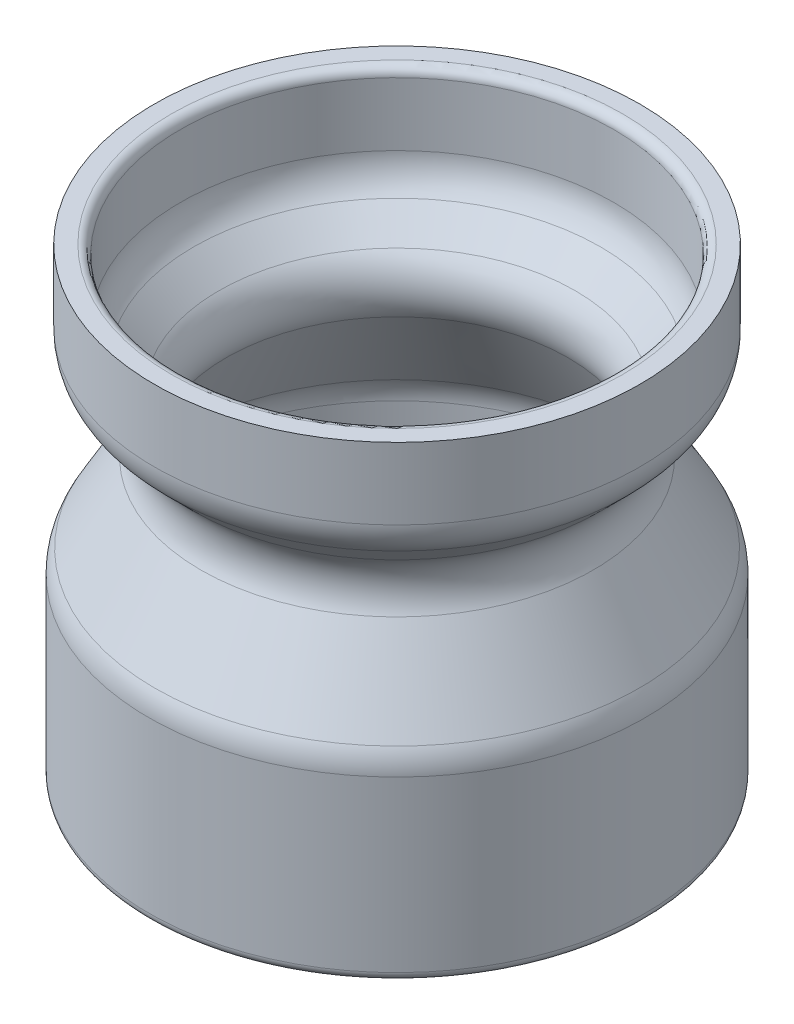
ISO-10303-21;
HEADER;
FILE_DESCRIPTION(('STEP AP214'),'2;1');
FILE_NAME('part.step','',(''),(''),'','','');
FILE_SCHEMA(('AUTOMOTIVE_DESIGN { 1 0 10303 214 1 1 1 1 }'));
ENDSEC;
DATA;
#1=APPLICATION_CONTEXT('core data for automotive mechanical design processes');
#2=APPLICATION_PROTOCOL_DEFINITION('international standard','automotive_design',2000,#1);
#3=PRODUCT_CONTEXT('',#1,'mechanical');
#4=PRODUCT('Part','Part','',(#3));
#5=PRODUCT_RELATED_PRODUCT_CATEGORY('part','',(#4));
#6=PRODUCT_DEFINITION_FORMATION('','',#4);
#7=PRODUCT_DEFINITION_CONTEXT('part definition',#1,'design');
#8=PRODUCT_DEFINITION('design','',#6,#7);
#9=PRODUCT_DEFINITION_SHAPE('','',#8);
#10=(LENGTH_UNIT() NAMED_UNIT(*) SI_UNIT(.MILLI.,.METRE.));
#11=(NAMED_UNIT(*) PLANE_ANGLE_UNIT() SI_UNIT($,.RADIAN.));
#12=(NAMED_UNIT(*) SI_UNIT($,.STERADIAN.) SOLID_ANGLE_UNIT());
#13=UNCERTAINTY_MEASURE_WITH_UNIT(LENGTH_MEASURE(1.E-05),#10,'distance_accuracy_value','');
#14=(GEOMETRIC_REPRESENTATION_CONTEXT(3) GLOBAL_UNCERTAINTY_ASSIGNED_CONTEXT((#13)) GLOBAL_UNIT_ASSIGNED_CONTEXT((#10,
#11,#12)) REPRESENTATION_CONTEXT('',''));
#15=CARTESIAN_POINT('',(0.,0.,0.));
#16=DIRECTION('',(0.,0.,1.));
#17=DIRECTION('',(1.,0.,0.));
#18=AXIS2_PLACEMENT_3D('',#15,#16,#17);
#19=CARTESIAN_POINT('',(-24.,4.,0.));
#20=DIRECTION('',(0.,1.,0.));
#21=DIRECTION('',(0.,0.,1.));
#22=AXIS2_PLACEMENT_3D('',#19,#20,#21);
#23=PLANE('',#22);
#24=DIRECTION('',(0.,0.,-1.));
#25=VECTOR('',#24,1.);
#26=CARTESIAN_POINT('',(13.,4.,3.9));
#27=LINE('',#26,#25);
#28=CARTESIAN_POINT('',(13.,4.,3.9));
#29=VERTEX_POINT('',#28);
#30=CARTESIAN_POINT('',(13.,4.,-4.1));
#31=VERTEX_POINT('',#30);
#32=EDGE_CURVE('E106',#29,#31,#27,.T.);
#33=ORIENTED_EDGE('',*,*,#32,.F.);
#34=CARTESIAN_POINT('',(15.,4.,3.9));
#35=DIRECTION('',(0.,1.,0.));
#36=DIRECTION('',(0.,0.,1.));
#37=AXIS2_PLACEMENT_3D('',#34,#35,#36);
#38=CIRCLE('',#37,2.);
#39=CARTESIAN_POINT('',(17.,4.,3.9));
#40=VERTEX_POINT('',#39);
#41=EDGE_CURVE('E89',#40,#29,#38,.F.);
#42=ORIENTED_EDGE('',*,*,#41,.F.);
#43=DIRECTION('',(0.,0.,1.));
#44=VECTOR('',#43,1.);
#45=CARTESIAN_POINT('',(17.,4.,3.9));
#46=LINE('',#45,#44);
#47=CARTESIAN_POINT('',(17.,4.,-4.1));
#48=VERTEX_POINT('',#47);
#49=EDGE_CURVE('E98',#48,#40,#46,.T.);
#50=ORIENTED_EDGE('',*,*,#49,.F.);
#51=CARTESIAN_POINT('',(15.,4.,-4.1));
#52=DIRECTION('',(0.,1.,0.));
#53=DIRECTION('',(0.,0.,1.));
#54=AXIS2_PLACEMENT_3D('',#51,#52,#53);
#55=CIRCLE('',#54,2.);
#56=EDGE_CURVE('E61',#31,#48,#55,.F.);
#57=ORIENTED_EDGE('',*,*,#56,.F.);
#58=EDGE_LOOP('',(#33,#42,#50,#57));
#59=FACE_BOUND('',#58,.T.);
#60=CARTESIAN_POINT('',(0.,4.,0.));
#61=DIRECTION('',(0.,-1.,0.));
#62=DIRECTION('',(0.,0.,-1.));
#63=AXIS2_PLACEMENT_3D('',#60,#61,#62);
#64=CIRCLE('',#63,2.5);
#65=CARTESIAN_POINT('',(0.,4.,-2.5));
#66=VERTEX_POINT('',#65);
#67=EDGE_CURVE('E12',#66,#66,#64,.T.);
#68=ORIENTED_EDGE('',*,*,#67,.F.);
#69=EDGE_LOOP('',(#68));
#70=FACE_BOUND('',#69,.T.);
#71=CARTESIAN_POINT('',(0.,4.,0.));
#72=DIRECTION('',(0.,-1.,0.));
#73=DIRECTION('',(0.,0.,-1.));
#74=AXIS2_PLACEMENT_3D('',#71,#72,#73);
#75=CIRCLE('',#74,24.);
#76=CARTESIAN_POINT('',(0.,4.,-24.));
#77=VERTEX_POINT('',#76);
#78=EDGE_CURVE('E101',#77,#77,#75,.T.);
#79=ORIENTED_EDGE('',*,*,#78,.T.);
#80=EDGE_LOOP('',(#79));
#81=FACE_BOUND('',#80,.T.);
#82=ADVANCED_FACE('F47',(#59,#70,#81),#23,.F.);
#83=CARTESIAN_POINT('',(0.,0.,0.));
#84=DIRECTION('',(0.,-1.,0.));
#85=DIRECTION('',(0.,0.,-1.));
#86=AXIS2_PLACEMENT_3D('',#83,#84,#85);
#87=CYLINDRICAL_SURFACE('',#86,2.5);
#88=CARTESIAN_POINT('',(0.,6.,0.));
#89=DIRECTION('',(0.,-1.,0.));
#90=DIRECTION('',(0.,0.,-1.));
#91=AXIS2_PLACEMENT_3D('',#88,#89,#90);
#92=CIRCLE('',#91,2.5);
#93=CARTESIAN_POINT('',(0.,6.,-2.5));
#94=VERTEX_POINT('',#93);
#95=EDGE_CURVE('E54',#94,#94,#92,.T.);
#96=ORIENTED_EDGE('',*,*,#95,.F.);
#97=EDGE_LOOP('',(#96));
#98=FACE_BOUND('',#97,.T.);
#99=ORIENTED_EDGE('',*,*,#67,.T.);
#100=EDGE_LOOP('',(#99));
#101=FACE_BOUND('',#100,.T.);
#102=ADVANCED_FACE('F138',(#98,#101),#87,.F.);
#103=CARTESIAN_POINT('',(-2.5,6.,0.));
#104=DIRECTION('',(0.,-1.,0.));
#105=DIRECTION('',(0.,0.,-1.));
#106=AXIS2_PLACEMENT_3D('',#103,#104,#105);
#107=PLANE('',#106);
#108=DIRECTION('',(0.,0.,-1.));
#109=VECTOR('',#108,1.);
#110=CARTESIAN_POINT('',(17.,6.,3.9));
#111=LINE('',#110,#109);
#112=CARTESIAN_POINT('',(17.,6.,3.9));
#113=VERTEX_POINT('',#112);
#114=CARTESIAN_POINT('',(17.,6.,-4.1));
#115=VERTEX_POINT('',#114);
#116=EDGE_CURVE('E108',#113,#115,#111,.T.);
#117=ORIENTED_EDGE('',*,*,#116,.F.);
#118=CARTESIAN_POINT('',(15.,6.,3.9));
#119=DIRECTION('',(0.,1.,0.));
#120=DIRECTION('',(0.,0.,1.));
#121=AXIS2_PLACEMENT_3D('',#118,#119,#120);
#122=CIRCLE('',#121,2.);
#123=CARTESIAN_POINT('',(13.,6.,3.9));
#124=VERTEX_POINT('',#123);
#125=EDGE_CURVE('E69',#124,#113,#122,.T.);
#126=ORIENTED_EDGE('',*,*,#125,.F.);
#127=DIRECTION('',(0.,0.,1.));
#128=VECTOR('',#127,1.);
#129=CARTESIAN_POINT('',(13.,6.,3.9));
#130=LINE('',#129,#128);
#131=CARTESIAN_POINT('',(13.,6.,-4.1));
#132=VERTEX_POINT('',#131);
#133=EDGE_CURVE('E95',#132,#124,#130,.T.);
#134=ORIENTED_EDGE('',*,*,#133,.F.);
#135=CARTESIAN_POINT('',(15.,6.,-4.1));
#136=DIRECTION('',(0.,1.,0.));
#137=DIRECTION('',(0.,0.,1.));
#138=AXIS2_PLACEMENT_3D('',#135,#136,#137);
#139=CIRCLE('',#138,2.);
#140=EDGE_CURVE('E114',#115,#132,#139,.T.);
#141=ORIENTED_EDGE('',*,*,#140,.F.);
#142=EDGE_LOOP('',(#117,#126,#134,#141));
#143=FACE_BOUND('',#142,.T.);
#144=CARTESIAN_POINT('',(0.,6.,0.));
#145=DIRECTION('',(0.,-1.,0.));
#146=DIRECTION('',(0.,0.,-1.));
#147=AXIS2_PLACEMENT_3D('',#144,#145,#146);
#148=CIRCLE('',#147,24.);
#149=CARTESIAN_POINT('',(0.,6.,-24.));
#150=VERTEX_POINT('',#149);
#151=EDGE_CURVE('E131',#150,#150,#148,.T.);
#152=ORIENTED_EDGE('',*,*,#151,.F.);
#153=EDGE_LOOP('',(#152));
#154=FACE_BOUND('',#153,.T.);
#155=ORIENTED_EDGE('',*,*,#95,.T.);
#156=EDGE_LOOP('',(#155));
#157=FACE_BOUND('',#156,.T.);
#158=ADVANCED_FACE('F136',(#143,#154,#157),#107,.F.);
#159=CARTESIAN_POINT('',(0.,5.5,0.));
#160=DIRECTION('',(0.,-1.,0.));
#161=DIRECTION('',(0.,0.,-1.));
#162=AXIS2_PLACEMENT_3D('',#159,#160,#161);
#163=TOROIDAL_SURFACE('',#162,24.,0.5);
#164=CARTESIAN_POINT('',(0.,5.49999999999999,0.));
#165=DIRECTION('',(0.,-1.,0.));
#166=DIRECTION('',(0.,0.,-1.));
#167=AXIS2_PLACEMENT_3D('',#164,#165,#166);
#168=CIRCLE('',#167,24.5);
#169=CARTESIAN_POINT('',(0.,5.49999999999999,-24.5));
#170=VERTEX_POINT('',#169);
#171=EDGE_CURVE('E128',#170,#170,#168,.T.);
#172=ORIENTED_EDGE('',*,*,#171,.F.);
#173=EDGE_LOOP('',(#172));
#174=FACE_BOUND('',#173,.T.);
#175=ORIENTED_EDGE('',*,*,#151,.T.);
#176=EDGE_LOOP('',(#175));
#177=FACE_BOUND('',#176,.T.);
#178=ADVANCED_FACE('F155',(#174,#177),#163,.T.);
#179=CARTESIAN_POINT('',(0.,0.,0.));
#180=DIRECTION('',(0.,-1.,0.));
#181=DIRECTION('',(0.,0.,-1.));
#182=AXIS2_PLACEMENT_3D('',#179,#180,#181);
#183=CYLINDRICAL_SURFACE('',#182,24.5);
#184=CARTESIAN_POINT('',(0.,4.5,0.));
#185=DIRECTION('',(0.,-1.,0.));
#186=DIRECTION('',(0.,0.,-1.));
#187=AXIS2_PLACEMENT_3D('',#184,#185,#186);
#188=CIRCLE('',#187,24.5);
#189=CARTESIAN_POINT('',(0.,4.5,-24.5));
#190=VERTEX_POINT('',#189);
#191=EDGE_CURVE('E125',#190,#190,#188,.T.);
#192=ORIENTED_EDGE('',*,*,#191,.F.);
#193=EDGE_LOOP('',(#192));
#194=FACE_BOUND('',#193,.T.);
#195=ORIENTED_EDGE('',*,*,#171,.T.);
#196=EDGE_LOOP('',(#195));
#197=FACE_BOUND('',#196,.T.);
#198=ADVANCED_FACE('F149',(#194,#197),#183,.T.);
#199=CARTESIAN_POINT('',(0.,4.5,0.));
#200=DIRECTION('',(0.,-1.,0.));
#201=DIRECTION('',(0.,0.,-1.));
#202=AXIS2_PLACEMENT_3D('',#199,#200,#201);
#203=TOROIDAL_SURFACE('',#202,24.,0.5);
#204=ORIENTED_EDGE('',*,*,#78,.F.);
#205=EDGE_LOOP('',(#204));
#206=FACE_BOUND('',#205,.T.);
#207=ORIENTED_EDGE('',*,*,#191,.T.);
#208=EDGE_LOOP('',(#207));
#209=FACE_BOUND('',#208,.T.);
#210=ADVANCED_FACE('F146',(#206,#209),#203,.T.);
#211=CARTESIAN_POINT('',(15.,-0.00100000000000273,3.9));
#212=DIRECTION('',(0.,1.,0.));
#213=DIRECTION('',(0.,0.,1.));
#214=AXIS2_PLACEMENT_3D('',#211,#212,#213);
#215=CYLINDRICAL_SURFACE('',#214,2.);
#216=ORIENTED_EDGE('',*,*,#41,.T.);
#217=DIRECTION('',(0.,1.,0.));
#218=VECTOR('',#217,1.);
#219=CARTESIAN_POINT('',(13.,-0.00100000000000273,3.9));
#220=LINE('',#219,#218);
#221=EDGE_CURVE('E102',#29,#124,#220,.T.);
#222=ORIENTED_EDGE('',*,*,#221,.T.);
#223=ORIENTED_EDGE('',*,*,#125,.T.);
#224=DIRECTION('',(0.,1.,0.));
#225=VECTOR('',#224,1.);
#226=CARTESIAN_POINT('',(17.,-0.00100000000000273,3.9));
#227=LINE('',#226,#225);
#228=EDGE_CURVE('E85',#40,#113,#227,.T.);
#229=ORIENTED_EDGE('',*,*,#228,.F.);
#230=EDGE_LOOP('',(#216,#222,#223,#229));
#231=FACE_BOUND('',#230,.T.);
#232=ADVANCED_FACE('F87',(#231),#215,.F.);
#233=CARTESIAN_POINT('',(13.,-0.00100000000000273,3.9));
#234=DIRECTION('',(-1.,0.,0.));
#235=DIRECTION('',(0.,0.,1.));
#236=AXIS2_PLACEMENT_3D('',#233,#234,#235);
#237=PLANE('',#236);
#238=ORIENTED_EDGE('',*,*,#32,.T.);
#239=DIRECTION('',(0.,1.,0.));
#240=VECTOR('',#239,1.);
#241=CARTESIAN_POINT('',(13.,-0.00100000000000273,-4.1));
#242=LINE('',#241,#240);
#243=EDGE_CURVE('E120',#31,#132,#242,.T.);
#244=ORIENTED_EDGE('',*,*,#243,.T.);
#245=ORIENTED_EDGE('',*,*,#133,.T.);
#246=ORIENTED_EDGE('',*,*,#221,.F.);
#247=EDGE_LOOP('',(#238,#244,#245,#246));
#248=FACE_BOUND('',#247,.T.);
#249=ADVANCED_FACE('F172',(#248),#237,.F.);
#250=CARTESIAN_POINT('',(15.,-0.00100000000000273,-4.1));
#251=DIRECTION('',(0.,1.,0.));
#252=DIRECTION('',(0.,0.,1.));
#253=AXIS2_PLACEMENT_3D('',#250,#251,#252);
#254=CYLINDRICAL_SURFACE('',#253,2.);
#255=ORIENTED_EDGE('',*,*,#56,.T.);
#256=DIRECTION('',(0.,1.,0.));
#257=VECTOR('',#256,1.);
#258=CARTESIAN_POINT('',(17.,-0.00100000000000273,-4.1));
#259=LINE('',#258,#257);
#260=EDGE_CURVE('E94',#48,#115,#259,.T.);
#261=ORIENTED_EDGE('',*,*,#260,.T.);
#262=ORIENTED_EDGE('',*,*,#140,.T.);
#263=ORIENTED_EDGE('',*,*,#243,.F.);
#264=EDGE_LOOP('',(#255,#261,#262,#263));
#265=FACE_BOUND('',#264,.T.);
#266=ADVANCED_FACE('F175',(#265),#254,.F.);
#267=CARTESIAN_POINT('',(17.,-0.00100000000000273,3.9));
#268=DIRECTION('',(1.,0.,0.));
#269=DIRECTION('',(0.,0.,-1.));
#270=AXIS2_PLACEMENT_3D('',#267,#268,#269);
#271=PLANE('',#270);
#272=ORIENTED_EDGE('',*,*,#49,.T.);
#273=ORIENTED_EDGE('',*,*,#228,.T.);
#274=ORIENTED_EDGE('',*,*,#116,.T.);
#275=ORIENTED_EDGE('',*,*,#260,.F.);
#276=EDGE_LOOP('',(#272,#273,#274,#275));
#277=FACE_BOUND('',#276,.T.);
#278=ADVANCED_FACE('F99',(#277),#271,.F.);
#279=CLOSED_SHELL('',(#82,#102,#158,#178,#198,#210,#232,#249,#266,#278));
#280=MANIFOLD_SOLID_BREP('B2',#279);
#281=CARTESIAN_POINT('',(0.,0.,0.));
#282=DIRECTION('',(0.,-1.,0.));
#283=DIRECTION('',(0.,0.,-1.));
#284=AXIS2_PLACEMENT_3D('',#281,#282,#283);
#285=CYLINDRICAL_SURFACE('',#284,2.5);
#286=CARTESIAN_POINT('',(0.,2.,0.));
#287=DIRECTION('',(0.,-1.,0.));
#288=DIRECTION('',(0.,0.,-1.));
#289=AXIS2_PLACEMENT_3D('',#286,#287,#288);
#290=CIRCLE('',#289,2.5);
#291=CARTESIAN_POINT('',(0.,2.,-2.5));
#292=VERTEX_POINT('',#291);
#293=EDGE_CURVE('E297',#292,#292,#290,.T.);
#294=ORIENTED_EDGE('',*,*,#293,.F.);
#295=EDGE_LOOP('',(#294));
#296=FACE_BOUND('',#295,.T.);
#297=CARTESIAN_POINT('',(0.,0.,0.));
#298=DIRECTION('',(0.,-1.,0.));
#299=DIRECTION('',(0.,0.,-1.));
#300=AXIS2_PLACEMENT_3D('',#297,#298,#299);
#301=CIRCLE('',#300,2.5);
#302=CARTESIAN_POINT('',(0.,0.,-2.5));
#303=VERTEX_POINT('',#302);
#304=EDGE_CURVE('E45',#303,#303,#301,.T.);
#305=ORIENTED_EDGE('',*,*,#304,.T.);
#306=EDGE_LOOP('',(#305));
#307=FACE_BOUND('',#306,.T.);
#308=ADVANCED_FACE('F243',(#296,#307),#285,.F.);
#309=CARTESIAN_POINT('',(-2.5,0.,0.));
#310=DIRECTION('',(0.,1.,0.));
#311=DIRECTION('',(0.,0.,1.));
#312=AXIS2_PLACEMENT_3D('',#309,#310,#311);
#313=PLANE('',#312);
#314=DIRECTION('',(0.,0.,1.));
#315=VECTOR('',#314,1.);
#316=CARTESIAN_POINT('',(-13.,0.,-3.9));
#317=LINE('',#316,#315);
#318=CARTESIAN_POINT('',(-13.,0.,-3.9));
#319=VERTEX_POINT('',#318);
#320=CARTESIAN_POINT('',(-13.,0.,4.1));
#321=VERTEX_POINT('',#320);
#322=EDGE_CURVE('E305',#319,#321,#317,.T.);
#323=ORIENTED_EDGE('',*,*,#322,.F.);
#324=CARTESIAN_POINT('',(-15.,0.,-3.9));
#325=DIRECTION('',(0.,-1.,0.));
#326=DIRECTION('',(0.,0.,-1.));
#327=AXIS2_PLACEMENT_3D('',#324,#325,#326);
#328=CIRCLE('',#327,2.);
#329=CARTESIAN_POINT('',(-17.,0.,-3.9));
#330=VERTEX_POINT('',#329);
#331=EDGE_CURVE('E257',#330,#319,#328,.T.);
#332=ORIENTED_EDGE('',*,*,#331,.F.);
#333=DIRECTION('',(0.,0.,-1.));
#334=VECTOR('',#333,1.);
#335=CARTESIAN_POINT('',(-17.,0.,-3.9));
#336=LINE('',#335,#334);
#337=CARTESIAN_POINT('',(-17.,0.,4.1));
#338=VERTEX_POINT('',#337);
#339=EDGE_CURVE('E291',#338,#330,#336,.T.);
#340=ORIENTED_EDGE('',*,*,#339,.F.);
#341=CARTESIAN_POINT('',(-15.,0.,4.1));
#342=DIRECTION('',(0.,-1.,0.));
#343=DIRECTION('',(0.,0.,-1.));
#344=AXIS2_PLACEMENT_3D('',#341,#342,#343);
#345=CIRCLE('',#344,2.);
#346=EDGE_CURVE('E311',#321,#338,#345,.T.);
#347=ORIENTED_EDGE('',*,*,#346,.F.);
#348=EDGE_LOOP('',(#323,#332,#340,#347));
#349=FACE_BOUND('',#348,.T.);
#350=ORIENTED_EDGE('',*,*,#304,.F.);
#351=EDGE_LOOP('',(#350));
#352=FACE_BOUND('',#351,.T.);
#353=CARTESIAN_POINT('',(0.,0.,0.));
#354=DIRECTION('',(0.,-1.,0.));
#355=DIRECTION('',(0.,0.,-1.));
#356=AXIS2_PLACEMENT_3D('',#353,#354,#355);
#357=CIRCLE('',#356,26.5);
#358=CARTESIAN_POINT('',(0.,0.,-26.5));
#359=VERTEX_POINT('',#358);
#360=EDGE_CURVE('E250',#359,#359,#357,.T.);
#361=ORIENTED_EDGE('',*,*,#360,.T.);
#362=EDGE_LOOP('',(#361));
#363=FACE_BOUND('',#362,.T.);
#364=ADVANCED_FACE('F378',(#349,#352,#363),#313,.F.);
#365=CARTESIAN_POINT('',(0.,0.999999999999997,0.));
#366=DIRECTION('',(0.,-1.,0.));
#367=DIRECTION('',(0.,0.,-1.));
#368=AXIS2_PLACEMENT_3D('',#365,#366,#367);
#369=TOROIDAL_SURFACE('',#368,26.5,1.);
#370=ORIENTED_EDGE('',*,*,#360,.F.);
#371=EDGE_LOOP('',(#370));
#372=FACE_BOUND('',#371,.T.);
#373=CARTESIAN_POINT('',(0.,0.999999999999997,0.));
#374=DIRECTION('',(0.,-1.,0.));
#375=DIRECTION('',(0.,0.,-1.));
#376=AXIS2_PLACEMENT_3D('',#373,#374,#375);
#377=CIRCLE('',#376,27.5);
#378=CARTESIAN_POINT('',(0.,0.999999999999997,-27.5));
#379=VERTEX_POINT('',#378);
#380=EDGE_CURVE('E373',#379,#379,#377,.T.);
#381=ORIENTED_EDGE('',*,*,#380,.T.);
#382=EDGE_LOOP('',(#381));
#383=FACE_BOUND('',#382,.T.);
#384=ADVANCED_FACE('F380',(#372,#383),#369,.T.);
#385=CARTESIAN_POINT('',(0.,0.,0.));
#386=DIRECTION('',(0.,-1.,0.));
#387=DIRECTION('',(0.,0.,-1.));
#388=AXIS2_PLACEMENT_3D('',#385,#386,#387);
#389=CYLINDRICAL_SURFACE('',#388,27.5);
#390=ORIENTED_EDGE('',*,*,#380,.F.);
#391=EDGE_LOOP('',(#390));
#392=FACE_BOUND('',#391,.T.);
#393=CARTESIAN_POINT('',(0.,19.7594108681067,0.));
#394=DIRECTION('',(0.,-1.,0.));
#395=DIRECTION('',(0.,0.,-1.));
#396=AXIS2_PLACEMENT_3D('',#393,#394,#395);
#397=CIRCLE('',#396,27.5);
#398=CARTESIAN_POINT('',(0.,19.7594108681067,-27.5));
#399=VERTEX_POINT('',#398);
#400=EDGE_CURVE('E370',#399,#399,#397,.T.);
#401=ORIENTED_EDGE('',*,*,#400,.T.);
#402=EDGE_LOOP('',(#401));
#403=FACE_BOUND('',#402,.T.);
#404=ADVANCED_FACE('F383',(#392,#403),#389,.T.);
#405=CARTESIAN_POINT('',(0.,19.7594108681067,0.));
#406=DIRECTION('',(0.,-1.,0.));
#407=DIRECTION('',(0.,0.,-1.));
#408=AXIS2_PLACEMENT_3D('',#405,#406,#407);
#409=TOROIDAL_SURFACE('',#408,22.5,5.);
#410=ORIENTED_EDGE('',*,*,#400,.F.);
#411=EDGE_LOOP('',(#410));
#412=FACE_BOUND('',#411,.T.);
#413=CARTESIAN_POINT('',(0.,22.2594108681067,0.));
#414=DIRECTION('',(0.,-1.,0.));
#415=DIRECTION('',(0.,0.,-1.));
#416=AXIS2_PLACEMENT_3D('',#413,#414,#415);
#417=CIRCLE('',#416,26.8301270189222);
#418=CARTESIAN_POINT('',(0.,22.2594108681067,-26.8301270189222));
#419=VERTEX_POINT('',#418);
#420=EDGE_CURVE('E367',#419,#419,#417,.T.);
#421=ORIENTED_EDGE('',*,*,#420,.T.);
#422=EDGE_LOOP('',(#421));
#423=FACE_BOUND('',#422,.T.);
#424=ADVANCED_FACE('F389',(#412,#423),#409,.T.);
#425=CARTESIAN_POINT('',(0.,31.0600265176964,0.));
#426=DIRECTION('',(0.,-1.,0.));
#427=DIRECTION('',(0.,0.,-1.));
#428=AXIS2_PLACEMENT_3D('',#425,#426,#427);
#429=CONICAL_SURFACE('',#428,21.7490892045971,0.5235987755983);
#430=ORIENTED_EDGE('',*,*,#420,.F.);
#431=EDGE_LOOP('',(#430));
#432=FACE_BOUND('',#431,.T.);
#433=CARTESIAN_POINT('',(0.,31.0600265176964,0.));
#434=DIRECTION('',(0.,-1.,0.));
#435=DIRECTION('',(0.,0.,-1.));
#436=AXIS2_PLACEMENT_3D('',#433,#434,#435);
#437=CIRCLE('',#436,21.7490892045971);
#438=CARTESIAN_POINT('',(0.,31.0600265176964,-21.7490892045971));
#439=VERTEX_POINT('',#438);
#440=EDGE_CURVE('E364',#439,#439,#437,.T.);
#441=ORIENTED_EDGE('',*,*,#440,.T.);
#442=EDGE_LOOP('',(#441));
#443=FACE_BOUND('',#442,.T.);
#444=ADVANCED_FACE('F395',(#432,#443),#429,.T.);
#445=CARTESIAN_POINT('',(0.,33.5600265176964,0.));
#446=DIRECTION('',(0.,-1.,0.));
#447=DIRECTION('',(0.,0.,-1.));
#448=AXIS2_PLACEMENT_3D('',#445,#446,#447);
#449=TOROIDAL_SURFACE('',#448,26.0792162235193,5.);
#450=ORIENTED_EDGE('',*,*,#440,.F.);
#451=EDGE_LOOP('',(#450));
#452=FACE_BOUND('',#451,.T.);
#453=CARTESIAN_POINT('',(0.,37.0955604236291,0.));
#454=DIRECTION('',(0.,-1.,0.));
#455=DIRECTION('',(0.,0.,-1.));
#456=AXIS2_PLACEMENT_3D('',#453,#454,#455);
#457=CIRCLE('',#456,22.5436823175865);
#458=CARTESIAN_POINT('',(0.,37.0955604236291,-22.5436823175865));
#459=VERTEX_POINT('',#458);
#460=EDGE_CURVE('E361',#459,#459,#457,.T.);
#461=ORIENTED_EDGE('',*,*,#460,.T.);
#462=EDGE_LOOP('',(#461));
#463=FACE_BOUND('',#462,.T.);
#464=ADVANCED_FACE('F401',(#452,#463),#449,.F.);
#465=CARTESIAN_POINT('',(0.,39.9892515584906,0.));
#466=DIRECTION('',(0.,1.,0.));
#467=DIRECTION('',(0.,0.,1.));
#468=AXIS2_PLACEMENT_3D('',#465,#466,#467);
#469=CONICAL_SURFACE('',#468,25.4373734524479,0.785398163397429);
#470=ORIENTED_EDGE('',*,*,#460,.F.);
#471=EDGE_LOOP('',(#470));
#472=FACE_BOUND('',#471,.T.);
#473=CARTESIAN_POINT('',(0.,39.9892515584906,0.));
#474=DIRECTION('',(0.,-1.,0.));
#475=DIRECTION('',(0.,0.,-1.));
#476=AXIS2_PLACEMENT_3D('',#473,#474,#475);
#477=CIRCLE('',#476,25.4373734524479);
#478=CARTESIAN_POINT('',(0.,39.9892515584906,-25.4373734524479));
#479=VERTEX_POINT('',#478);
#480=EDGE_CURVE('E358',#479,#479,#477,.T.);
#481=ORIENTED_EDGE('',*,*,#480,.T.);
#482=EDGE_LOOP('',(#481));
#483=FACE_BOUND('',#482,.T.);
#484=ADVANCED_FACE('F407',(#472,#483),#469,.T.);
#485=CARTESIAN_POINT('',(0.,43.5247854644232,0.));
#486=DIRECTION('',(0.,-1.,0.));
#487=DIRECTION('',(0.,0.,-1.));
#488=AXIS2_PLACEMENT_3D('',#485,#486,#487);
#489=TOROIDAL_SURFACE('',#488,21.9018395465151,5.);
#490=ORIENTED_EDGE('',*,*,#480,.F.);
#491=EDGE_LOOP('',(#490));
#492=FACE_BOUND('',#491,.T.);
#493=CARTESIAN_POINT('',(0.,43.5247854644232,0.));
#494=DIRECTION('',(0.,-1.,0.));
#495=DIRECTION('',(0.,0.,-1.));
#496=AXIS2_PLACEMENT_3D('',#493,#494,#495);
#497=CIRCLE('',#496,26.9018395465151);
#498=CARTESIAN_POINT('',(0.,43.5247854644232,-26.9018395465151));
#499=VERTEX_POINT('',#498);
#500=EDGE_CURVE('E355',#499,#499,#497,.T.);
#501=ORIENTED_EDGE('',*,*,#500,.T.);
#502=EDGE_LOOP('',(#501));
#503=FACE_BOUND('',#502,.T.);
#504=ADVANCED_FACE('F413',(#492,#503),#489,.T.);
#505=CARTESIAN_POINT('',(0.,0.,0.));
#506=DIRECTION('',(0.,-1.,0.));
#507=DIRECTION('',(0.,0.,-1.));
#508=AXIS2_PLACEMENT_3D('',#505,#506,#507);
#509=CYLINDRICAL_SURFACE('',#508,26.9018395465151);
#510=ORIENTED_EDGE('',*,*,#500,.F.);
#511=EDGE_LOOP('',(#510));
#512=FACE_BOUND('',#511,.T.);
#513=CARTESIAN_POINT('',(0.,51.4537176525578,0.));
#514=DIRECTION('',(0.,-1.,0.));
#515=DIRECTION('',(0.,0.,-1.));
#516=AXIS2_PLACEMENT_3D('',#513,#514,#515);
#517=CIRCLE('',#516,26.9018395465151);
#518=CARTESIAN_POINT('',(0.,51.4537176525578,-26.9018395465151));
#519=VERTEX_POINT('',#518);
#520=EDGE_CURVE('E352',#519,#519,#517,.T.);
#521=ORIENTED_EDGE('',*,*,#520,.T.);
#522=EDGE_LOOP('',(#521));
#523=FACE_BOUND('',#522,.T.);
#524=ADVANCED_FACE('F419',(#512,#523),#509,.T.);
#525=CARTESIAN_POINT('',(-25.0087993028391,51.4537176525578,0.));
#526=DIRECTION('',(0.,-1.,0.));
#527=DIRECTION('',(0.,0.,-1.));
#528=AXIS2_PLACEMENT_3D('',#525,#526,#527);
#529=PLANE('',#528);
#530=ORIENTED_EDGE('',*,*,#520,.F.);
#531=EDGE_LOOP('',(#530));
#532=FACE_BOUND('',#531,.T.);
#533=CARTESIAN_POINT('',(0.,51.4537176525578,0.));
#534=DIRECTION('',(0.,-1.,0.));
#535=DIRECTION('',(0.,0.,-1.));
#536=AXIS2_PLACEMENT_3D('',#533,#534,#535);
#537=CIRCLE('',#536,25.0087993028391);
#538=CARTESIAN_POINT('',(0.,51.4537176525578,-25.0087993028391));
#539=VERTEX_POINT('',#538);
#540=EDGE_CURVE('E349',#539,#539,#537,.T.);
#541=ORIENTED_EDGE('',*,*,#540,.T.);
#542=EDGE_LOOP('',(#541));
#543=FACE_BOUND('',#542,.T.);
#544=ADVANCED_FACE('F425',(#532,#543),#529,.F.);
#545=CARTESIAN_POINT('',(0.,50.4537176525578,0.));
#546=DIRECTION('',(0.,-1.,0.));
#547=DIRECTION('',(0.,0.,-1.));
#548=AXIS2_PLACEMENT_3D('',#545,#546,#547);
#549=TOROIDAL_SURFACE('',#548,25.0087993028392,0.999999999999997);
#550=ORIENTED_EDGE('',*,*,#540,.F.);
#551=EDGE_LOOP('',(#550));
#552=FACE_BOUND('',#551,.T.);
#553=CARTESIAN_POINT('',(0.,50.4537176525578,0.));
#554=DIRECTION('',(0.,-1.,0.));
#555=DIRECTION('',(0.,0.,-1.));
#556=AXIS2_PLACEMENT_3D('',#553,#554,#555);
#557=CIRCLE('',#556,24.0087993028392);
#558=CARTESIAN_POINT('',(0.,50.4537176525578,-24.0087993028392));
#559=VERTEX_POINT('',#558);
#560=EDGE_CURVE('E346',#559,#559,#557,.T.);
#561=ORIENTED_EDGE('',*,*,#560,.T.);
#562=EDGE_LOOP('',(#561));
#563=FACE_BOUND('',#562,.T.);
#564=ADVANCED_FACE('F431',(#552,#563),#549,.T.);
#565=CARTESIAN_POINT('',(0.,0.,0.));
#566=DIRECTION('',(0.,-1.,0.));
#567=DIRECTION('',(0.,0.,-1.));
#568=AXIS2_PLACEMENT_3D('',#565,#566,#567);
#569=CYLINDRICAL_SURFACE('',#568,24.0087993028392);
#570=ORIENTED_EDGE('',*,*,#560,.F.);
#571=EDGE_LOOP('',(#570));
#572=FACE_BOUND('',#571,.T.);
#573=CARTESIAN_POINT('',(0.,43.4601723454934,0.));
#574=DIRECTION('',(0.,-1.,0.));
#575=DIRECTION('',(0.,0.,-1.));
#576=AXIS2_PLACEMENT_3D('',#573,#574,#575);
#577=CIRCLE('',#576,24.0087993028392);
#578=CARTESIAN_POINT('',(0.,43.4601723454934,-24.0087993028392));
#579=VERTEX_POINT('',#578);
#580=EDGE_CURVE('E343',#579,#579,#577,.T.);
#581=ORIENTED_EDGE('',*,*,#580,.T.);
#582=EDGE_LOOP('',(#581));
#583=FACE_BOUND('',#582,.T.);
#584=ADVANCED_FACE('F437',(#572,#583),#569,.F.);
#585=CARTESIAN_POINT('',(0.,43.4601723454934,0.));
#586=DIRECTION('',(0.,-1.,0.));
#587=DIRECTION('',(0.,0.,-1.));
#588=AXIS2_PLACEMENT_3D('',#585,#586,#587);
#589=TOROIDAL_SURFACE('',#588,19.0087993028392,5.);
#590=ORIENTED_EDGE('',*,*,#580,.F.);
#591=EDGE_LOOP('',(#590));
#592=FACE_BOUND('',#591,.T.);
#593=CARTESIAN_POINT('',(0.,39.9246384395608,0.));
#594=DIRECTION('',(0.,-1.,0.));
#595=DIRECTION('',(0.,0.,-1.));
#596=AXIS2_PLACEMENT_3D('',#593,#594,#595);
#597=CIRCLE('',#596,22.544333208772);
#598=CARTESIAN_POINT('',(0.,39.9246384395608,-22.544333208772));
#599=VERTEX_POINT('',#598);
#600=EDGE_CURVE('E340',#599,#599,#597,.T.);
#601=ORIENTED_EDGE('',*,*,#600,.T.);
#602=EDGE_LOOP('',(#601));
#603=FACE_BOUND('',#602,.T.);
#604=ADVANCED_FACE('F443',(#592,#603),#589,.F.);
#605=CARTESIAN_POINT('',(0.,37.122047683819,0.));
#606=DIRECTION('',(0.,1.,0.));
#607=DIRECTION('',(0.,0.,1.));
#608=AXIS2_PLACEMENT_3D('',#605,#606,#607);
#609=CONICAL_SURFACE('',#608,19.7417424530304,0.785398163397427);
#610=ORIENTED_EDGE('',*,*,#600,.F.);
#611=EDGE_LOOP('',(#610));
#612=FACE_BOUND('',#611,.T.);
#613=CARTESIAN_POINT('',(0.,37.122047683819,0.));
#614=DIRECTION('',(0.,-1.,0.));
#615=DIRECTION('',(0.,0.,-1.));
#616=AXIS2_PLACEMENT_3D('',#613,#614,#615);
#617=CIRCLE('',#616,19.7417424530304);
#618=CARTESIAN_POINT('',(0.,37.122047683819,-19.7417424530304));
#619=VERTEX_POINT('',#618);
#620=EDGE_CURVE('E337',#619,#619,#617,.T.);
#621=ORIENTED_EDGE('',*,*,#620,.T.);
#622=EDGE_LOOP('',(#621));
#623=FACE_BOUND('',#622,.T.);
#624=ADVANCED_FACE('F449',(#612,#623),#609,.F.);
#625=CARTESIAN_POINT('',(0.,33.5865137778864,0.));
#626=DIRECTION('',(0.,-1.,0.));
#627=DIRECTION('',(0.,0.,-1.));
#628=AXIS2_PLACEMENT_3D('',#625,#626,#627);
#629=TOROIDAL_SURFACE('',#628,23.2772763589632,5.);
#630=ORIENTED_EDGE('',*,*,#620,.F.);
#631=EDGE_LOOP('',(#630));
#632=FACE_BOUND('',#631,.T.);
#633=CARTESIAN_POINT('',(0.,31.0865137778864,0.));
#634=DIRECTION('',(0.,-1.,0.));
#635=DIRECTION('',(0.,0.,-1.));
#636=AXIS2_PLACEMENT_3D('',#633,#634,#635);
#637=CIRCLE('',#636,18.947149340041);
#638=CARTESIAN_POINT('',(0.,31.0865137778864,-18.947149340041));
#639=VERTEX_POINT('',#638);
#640=EDGE_CURVE('E334',#639,#639,#637,.T.);
#641=ORIENTED_EDGE('',*,*,#640,.T.);
#642=EDGE_LOOP('',(#641));
#643=FACE_BOUND('',#642,.T.);
#644=ADVANCED_FACE('F455',(#632,#643),#629,.T.);
#645=CARTESIAN_POINT('',(0.,20.8968975382705,0.));
#646=DIRECTION('',(0.,-1.,0.));
#647=DIRECTION('',(0.,0.,-1.));
#648=AXIS2_PLACEMENT_3D('',#645,#646,#647);
#649=CONICAL_SURFACE('',#648,24.8301270189222,0.523598775598299);
#650=ORIENTED_EDGE('',*,*,#640,.F.);
#651=EDGE_LOOP('',(#650));
#652=FACE_BOUND('',#651,.T.);
#653=CARTESIAN_POINT('',(0.,20.8968975382705,0.));
#654=DIRECTION('',(0.,-1.,0.));
#655=DIRECTION('',(0.,0.,-1.));
#656=AXIS2_PLACEMENT_3D('',#653,#654,#655);
#657=CIRCLE('',#656,24.8301270189222);
#658=CARTESIAN_POINT('',(0.,20.8968975382705,-24.8301270189222));
#659=VERTEX_POINT('',#658);
#660=EDGE_CURVE('E331',#659,#659,#657,.T.);
#661=ORIENTED_EDGE('',*,*,#660,.T.);
#662=EDGE_LOOP('',(#661));
#663=FACE_BOUND('',#662,.T.);
#664=ADVANCED_FACE('F461',(#652,#663),#649,.F.);
#665=CARTESIAN_POINT('',(0.,18.3968975382705,0.));
#666=DIRECTION('',(0.,-1.,0.));
#667=DIRECTION('',(0.,0.,-1.));
#668=AXIS2_PLACEMENT_3D('',#665,#666,#667);
#669=TOROIDAL_SURFACE('',#668,20.5,5.);
#670=ORIENTED_EDGE('',*,*,#660,.F.);
#671=EDGE_LOOP('',(#670));
#672=FACE_BOUND('',#671,.T.);
#673=CARTESIAN_POINT('',(0.,18.3968975382705,0.));
#674=DIRECTION('',(0.,-1.,0.));
#675=DIRECTION('',(0.,0.,-1.));
#676=AXIS2_PLACEMENT_3D('',#673,#674,#675);
#677=CIRCLE('',#676,25.5);
#678=CARTESIAN_POINT('',(0.,18.3968975382705,-25.5));
#679=VERTEX_POINT('',#678);
#680=EDGE_CURVE('E328',#679,#679,#677,.T.);
#681=ORIENTED_EDGE('',*,*,#680,.T.);
#682=EDGE_LOOP('',(#681));
#683=FACE_BOUND('',#682,.T.);
#684=ADVANCED_FACE('F467',(#672,#683),#669,.F.);
#685=CARTESIAN_POINT('',(0.,0.,0.));
#686=DIRECTION('',(0.,-1.,0.));
#687=DIRECTION('',(0.,0.,-1.));
#688=AXIS2_PLACEMENT_3D('',#685,#686,#687);
#689=CYLINDRICAL_SURFACE('',#688,25.5);
#690=ORIENTED_EDGE('',*,*,#680,.F.);
#691=EDGE_LOOP('',(#690));
#692=FACE_BOUND('',#691,.T.);
#693=CARTESIAN_POINT('',(0.,3.00000000000001,0.));
#694=DIRECTION('',(0.,-1.,0.));
#695=DIRECTION('',(0.,0.,-1.));
#696=AXIS2_PLACEMENT_3D('',#693,#694,#695);
#697=CIRCLE('',#696,25.5);
#698=CARTESIAN_POINT('',(0.,3.00000000000001,-25.5));
#699=VERTEX_POINT('',#698);
#700=EDGE_CURVE('E325',#699,#699,#697,.T.);
#701=ORIENTED_EDGE('',*,*,#700,.T.);
#702=EDGE_LOOP('',(#701));
#703=FACE_BOUND('',#702,.T.);
#704=ADVANCED_FACE('F473',(#692,#703),#689,.F.);
#705=CARTESIAN_POINT('',(0.,3.,0.));
#706=DIRECTION('',(0.,-1.,0.));
#707=DIRECTION('',(0.,0.,-1.));
#708=AXIS2_PLACEMENT_3D('',#705,#706,#707);
#709=TOROIDAL_SURFACE('',#708,24.5,1.);
#710=ORIENTED_EDGE('',*,*,#700,.F.);
#711=EDGE_LOOP('',(#710));
#712=FACE_BOUND('',#711,.T.);
#713=CARTESIAN_POINT('',(0.,2.,0.));
#714=DIRECTION('',(0.,-1.,0.));
#715=DIRECTION('',(0.,0.,-1.));
#716=AXIS2_PLACEMENT_3D('',#713,#714,#715);
#717=CIRCLE('',#716,24.5);
#718=CARTESIAN_POINT('',(0.,2.,-24.5));
#719=VERTEX_POINT('',#718);
#720=EDGE_CURVE('E322',#719,#719,#717,.T.);
#721=ORIENTED_EDGE('',*,*,#720,.T.);
#722=EDGE_LOOP('',(#721));
#723=FACE_BOUND('',#722,.T.);
#724=ADVANCED_FACE('F479',(#712,#723),#709,.F.);
#725=CARTESIAN_POINT('',(-24.5,2.,0.));
#726=DIRECTION('',(0.,-1.,0.));
#727=DIRECTION('',(0.,0.,-1.));
#728=AXIS2_PLACEMENT_3D('',#725,#726,#727);
#729=PLANE('',#728);
#730=DIRECTION('',(0.,0.,1.));
#731=VECTOR('',#730,1.);
#732=CARTESIAN_POINT('',(-17.,2.,-3.9));
#733=LINE('',#732,#731);
#734=CARTESIAN_POINT('',(-17.,2.,-3.9));
#735=VERTEX_POINT('',#734);
#736=CARTESIAN_POINT('',(-17.,2.,4.1));
#737=VERTEX_POINT('',#736);
#738=EDGE_CURVE('E303',#735,#737,#733,.T.);
#739=ORIENTED_EDGE('',*,*,#738,.F.);
#740=CARTESIAN_POINT('',(-15.,2.,-3.9));
#741=DIRECTION('',(0.,-1.,0.));
#742=DIRECTION('',(0.,0.,-1.));
#743=AXIS2_PLACEMENT_3D('',#740,#741,#742);
#744=CIRCLE('',#743,2.);
#745=CARTESIAN_POINT('',(-13.,2.,-3.9));
#746=VERTEX_POINT('',#745);
#747=EDGE_CURVE('E285',#746,#735,#744,.F.);
#748=ORIENTED_EDGE('',*,*,#747,.F.);
#749=DIRECTION('',(0.,0.,-1.));
#750=VECTOR('',#749,1.);
#751=CARTESIAN_POINT('',(-13.,2.,-3.9));
#752=LINE('',#751,#750);
#753=CARTESIAN_POINT('',(-13.,2.,4.1));
#754=VERTEX_POINT('',#753);
#755=EDGE_CURVE('E294',#754,#746,#752,.T.);
#756=ORIENTED_EDGE('',*,*,#755,.F.);
#757=CARTESIAN_POINT('',(-15.,2.,4.1));
#758=DIRECTION('',(0.,-1.,0.));
#759=DIRECTION('',(0.,0.,-1.));
#760=AXIS2_PLACEMENT_3D('',#757,#758,#759);
#761=CIRCLE('',#760,2.);
#762=EDGE_CURVE('E265',#737,#754,#761,.F.);
#763=ORIENTED_EDGE('',*,*,#762,.F.);
#764=EDGE_LOOP('',(#739,#748,#756,#763));
#765=FACE_BOUND('',#764,.T.);
#766=ORIENTED_EDGE('',*,*,#720,.F.);
#767=EDGE_LOOP('',(#766));
#768=FACE_BOUND('',#767,.T.);
#769=ORIENTED_EDGE('',*,*,#293,.T.);
#770=EDGE_LOOP('',(#769));
#771=FACE_BOUND('',#770,.T.);
#772=ADVANCED_FACE('F300',(#765,#768,#771),#729,.F.);
#773=CARTESIAN_POINT('',(-15.,51.4547176525578,-3.9));
#774=DIRECTION('',(0.,-1.,0.));
#775=DIRECTION('',(0.,0.,-1.));
#776=AXIS2_PLACEMENT_3D('',#773,#774,#775);
#777=CYLINDRICAL_SURFACE('',#776,2.);
#778=ORIENTED_EDGE('',*,*,#747,.T.);
#779=DIRECTION('',(0.,-1.,0.));
#780=VECTOR('',#779,1.);
#781=CARTESIAN_POINT('',(-17.,51.4547176525578,-3.9));
#782=LINE('',#781,#780);
#783=EDGE_CURVE('E298',#735,#330,#782,.T.);
#784=ORIENTED_EDGE('',*,*,#783,.T.);
#785=ORIENTED_EDGE('',*,*,#331,.T.);
#786=DIRECTION('',(0.,-1.,0.));
#787=VECTOR('',#786,1.);
#788=CARTESIAN_POINT('',(-13.,51.4547176525578,-3.9));
#789=LINE('',#788,#787);
#790=EDGE_CURVE('E281',#746,#319,#789,.T.);
#791=ORIENTED_EDGE('',*,*,#790,.F.);
#792=EDGE_LOOP('',(#778,#784,#785,#791));
#793=FACE_BOUND('',#792,.T.);
#794=ADVANCED_FACE('F283',(#793),#777,.F.);
#795=CARTESIAN_POINT('',(-17.,51.4547176525578,-3.9));
#796=DIRECTION('',(-1.,0.,0.));
#797=DIRECTION('',(0.,0.,1.));
#798=AXIS2_PLACEMENT_3D('',#795,#796,#797);
#799=PLANE('',#798);
#800=ORIENTED_EDGE('',*,*,#738,.T.);
#801=DIRECTION('',(0.,-1.,0.));
#802=VECTOR('',#801,1.);
#803=CARTESIAN_POINT('',(-17.,51.4547176525578,4.1));
#804=LINE('',#803,#802);
#805=EDGE_CURVE('E317',#737,#338,#804,.T.);
#806=ORIENTED_EDGE('',*,*,#805,.T.);
#807=ORIENTED_EDGE('',*,*,#339,.T.);
#808=ORIENTED_EDGE('',*,*,#783,.F.);
#809=EDGE_LOOP('',(#800,#806,#807,#808));
#810=FACE_BOUND('',#809,.T.);
#811=ADVANCED_FACE('F503',(#810),#799,.F.);
#812=CARTESIAN_POINT('',(-15.,51.4547176525578,4.1));
#813=DIRECTION('',(0.,-1.,0.));
#814=DIRECTION('',(0.,0.,-1.));
#815=AXIS2_PLACEMENT_3D('',#812,#813,#814);
#816=CYLINDRICAL_SURFACE('',#815,2.);
#817=ORIENTED_EDGE('',*,*,#762,.T.);
#818=DIRECTION('',(0.,-1.,0.));
#819=VECTOR('',#818,1.);
#820=CARTESIAN_POINT('',(-13.,51.4547176525578,4.1));
#821=LINE('',#820,#819);
#822=EDGE_CURVE('E290',#754,#321,#821,.T.);
#823=ORIENTED_EDGE('',*,*,#822,.T.);
#824=ORIENTED_EDGE('',*,*,#346,.T.);
#825=ORIENTED_EDGE('',*,*,#805,.F.);
#826=EDGE_LOOP('',(#817,#823,#824,#825));
#827=FACE_BOUND('',#826,.T.);
#828=ADVANCED_FACE('F506',(#827),#816,.F.);
#829=CARTESIAN_POINT('',(-13.,51.4547176525578,-3.9));
#830=DIRECTION('',(1.,0.,0.));
#831=DIRECTION('',(0.,0.,-1.));
#832=AXIS2_PLACEMENT_3D('',#829,#830,#831);
#833=PLANE('',#832);
#834=ORIENTED_EDGE('',*,*,#755,.T.);
#835=ORIENTED_EDGE('',*,*,#790,.T.);
#836=ORIENTED_EDGE('',*,*,#322,.T.);
#837=ORIENTED_EDGE('',*,*,#822,.F.);
#838=EDGE_LOOP('',(#834,#835,#836,#837));
#839=FACE_BOUND('',#838,.T.);
#840=ADVANCED_FACE('F295',(#839),#833,.F.);
#841=CLOSED_SHELL('',(#308,#364,#384,#404,#424,#444,#464,#484,#504,#524,#544,#564,#584,#604,
#624,#644,#664,#684,#704,#724,#772,#794,#811,#828,#840));
#842=MANIFOLD_SOLID_BREP('B6',#841);
#843=ADVANCED_BREP_SHAPE_REPRESENTATION('',(#18,#280,#842),#14);
#844=SHAPE_DEFINITION_REPRESENTATION(#9,#843);
ENDSEC;
END-ISO-10303-21;
